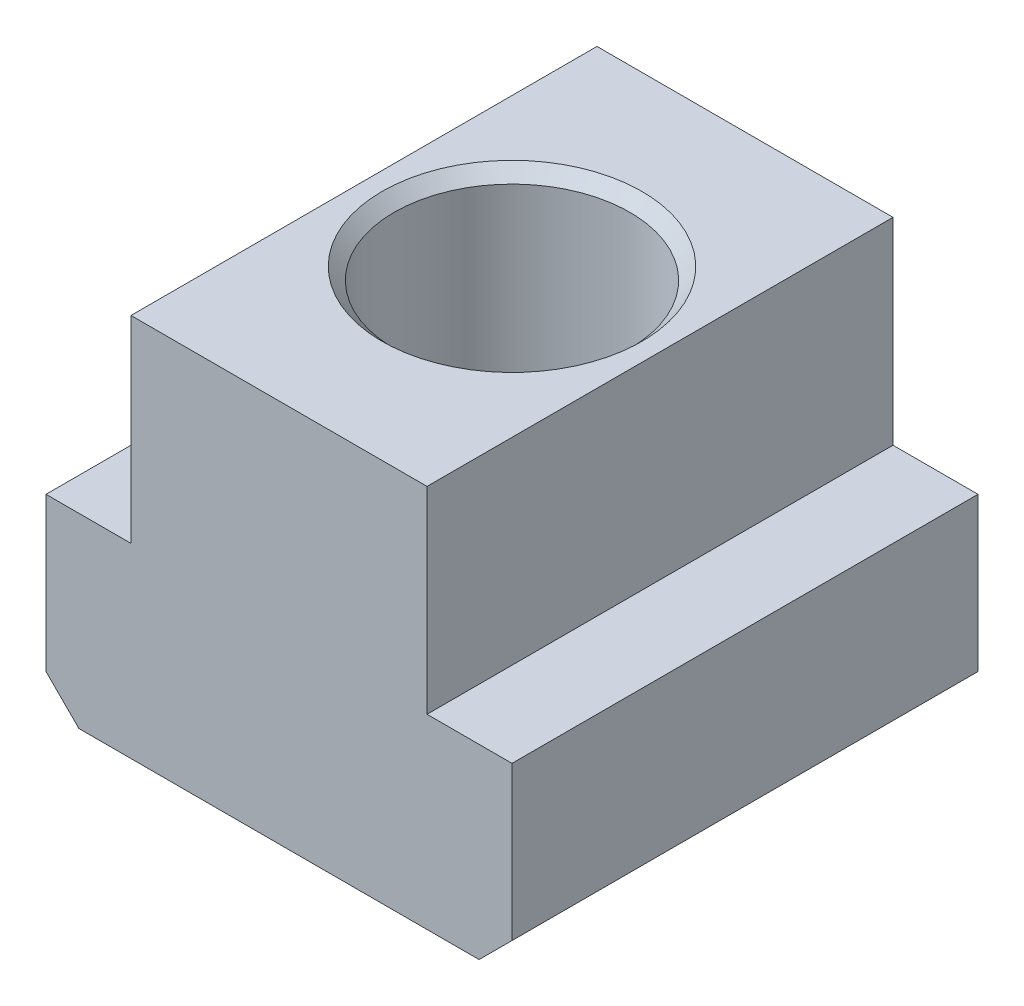
ISO-10303-21;
HEADER;
FILE_DESCRIPTION(('STEP AP214'),'2;1');
FILE_NAME('part.step','',(''),(''),'','','');
FILE_SCHEMA(('AUTOMOTIVE_DESIGN { 1 0 10303 214 1 1 1 1 }'));
ENDSEC;
DATA;
#1=APPLICATION_CONTEXT('core data for automotive mechanical design processes');
#2=APPLICATION_PROTOCOL_DEFINITION('international standard','automotive_design',2000,#1);
#3=PRODUCT_CONTEXT('',#1,'mechanical');
#4=PRODUCT('Part','Part','',(#3));
#5=PRODUCT_RELATED_PRODUCT_CATEGORY('part','',(#4));
#6=PRODUCT_DEFINITION_FORMATION('','',#4);
#7=PRODUCT_DEFINITION_CONTEXT('part definition',#1,'design');
#8=PRODUCT_DEFINITION('design','',#6,#7);
#9=PRODUCT_DEFINITION_SHAPE('','',#8);
#10=(LENGTH_UNIT() NAMED_UNIT(*) SI_UNIT(.MILLI.,.METRE.));
#11=(NAMED_UNIT(*) PLANE_ANGLE_UNIT() SI_UNIT($,.RADIAN.));
#12=(NAMED_UNIT(*) SI_UNIT($,.STERADIAN.) SOLID_ANGLE_UNIT());
#13=UNCERTAINTY_MEASURE_WITH_UNIT(LENGTH_MEASURE(1.E-05),#10,'distance_accuracy_value','');
#14=(GEOMETRIC_REPRESENTATION_CONTEXT(3) GLOBAL_UNCERTAINTY_ASSIGNED_CONTEXT((#13)) GLOBAL_UNIT_ASSIGNED_CONTEXT((#10,
#11,#12)) REPRESENTATION_CONTEXT('',''));
#15=CARTESIAN_POINT('',(0.,0.,0.));
#16=DIRECTION('',(0.,0.,1.));
#17=DIRECTION('',(1.,0.,0.));
#18=AXIS2_PLACEMENT_3D('',#15,#16,#17);
#19=CARTESIAN_POINT('',(-42.5,0.,-85.));
#20=DIRECTION('',(-1.,0.,0.));
#21=DIRECTION('',(0.,0.,1.));
#22=AXIS2_PLACEMENT_3D('',#19,#20,#21);
#23=PLANE('',#22);
#24=DIRECTION('',(0.,-1.,0.));
#25=VECTOR('',#24,1.);
#26=CARTESIAN_POINT('',(-42.5,0.,-85.));
#27=LINE('',#26,#25);
#28=CARTESIAN_POINT('',(-42.5,34.,-85.));
#29=VERTEX_POINT('',#28);
#30=CARTESIAN_POINT('',(-42.5,6.0000000000001,-85.));
#31=VERTEX_POINT('',#30);
#32=EDGE_CURVE('E166',#29,#31,#27,.T.);
#33=ORIENTED_EDGE('',*,*,#32,.T.);
#34=DIRECTION('',(0.,0.,1.));
#35=VECTOR('',#34,1.);
#36=CARTESIAN_POINT('',(-42.5,6.0000000000001,-85.));
#37=LINE('',#36,#35);
#38=CARTESIAN_POINT('',(-42.5,6.0000000000001,0.));
#39=VERTEX_POINT('',#38);
#40=EDGE_CURVE('E189',#31,#39,#37,.T.);
#41=ORIENTED_EDGE('',*,*,#40,.T.);
#42=DIRECTION('',(0.,-1.,0.));
#43=VECTOR('',#42,1.);
#44=CARTESIAN_POINT('',(-42.5,0.,0.));
#45=LINE('',#44,#43);
#46=CARTESIAN_POINT('',(-42.5,34.,0.));
#47=VERTEX_POINT('',#46);
#48=EDGE_CURVE('E145',#47,#39,#45,.T.);
#49=ORIENTED_EDGE('',*,*,#48,.F.);
#50=DIRECTION('',(0.,0.,1.));
#51=VECTOR('',#50,1.);
#52=CARTESIAN_POINT('',(-42.5,34.,-85.));
#53=LINE('',#52,#51);
#54=EDGE_CURVE('E167',#29,#47,#53,.T.);
#55=ORIENTED_EDGE('',*,*,#54,.F.);
#56=EDGE_LOOP('',(#33,#41,#49,#55));
#57=FACE_BOUND('',#56,.T.);
#58=ADVANCED_FACE('F32',(#57),#23,.T.);
#59=CARTESIAN_POINT('',(-42.5,34.,-85.));
#60=DIRECTION('',(0.,1.,0.));
#61=DIRECTION('',(0.,0.,1.));
#62=AXIS2_PLACEMENT_3D('',#59,#60,#61);
#63=PLANE('',#62);
#64=DIRECTION('',(-1.,0.,0.));
#65=VECTOR('',#64,1.);
#66=CARTESIAN_POINT('',(-42.5,34.,0.));
#67=LINE('',#66,#65);
#68=CARTESIAN_POINT('',(-27.,34.,0.));
#69=VERTEX_POINT('',#68);
#70=EDGE_CURVE('E163',#69,#47,#67,.T.);
#71=ORIENTED_EDGE('',*,*,#70,.F.);
#72=DIRECTION('',(0.,0.,1.));
#73=VECTOR('',#72,1.);
#74=CARTESIAN_POINT('',(-27.,34.,-85.));
#75=LINE('',#74,#73);
#76=CARTESIAN_POINT('',(-27.,34.,-85.));
#77=VERTEX_POINT('',#76);
#78=EDGE_CURVE('E170',#77,#69,#75,.T.);
#79=ORIENTED_EDGE('',*,*,#78,.F.);
#80=DIRECTION('',(-1.,0.,0.));
#81=VECTOR('',#80,1.);
#82=CARTESIAN_POINT('',(-42.5,34.,-85.));
#83=LINE('',#82,#81);
#84=EDGE_CURVE('E126',#77,#29,#83,.T.);
#85=ORIENTED_EDGE('',*,*,#84,.T.);
#86=ORIENTED_EDGE('',*,*,#54,.T.);
#87=EDGE_LOOP('',(#71,#79,#85,#86));
#88=FACE_BOUND('',#87,.T.);
#89=ADVANCED_FACE('F238',(#88),#63,.T.);
#90=CARTESIAN_POINT('',(-27.,34.,-85.));
#91=DIRECTION('',(-1.,0.,0.));
#92=DIRECTION('',(0.,0.,1.));
#93=AXIS2_PLACEMENT_3D('',#90,#91,#92);
#94=PLANE('',#93);
#95=DIRECTION('',(0.,-1.,0.));
#96=VECTOR('',#95,1.);
#97=CARTESIAN_POINT('',(-27.,34.,0.));
#98=LINE('',#97,#96);
#99=CARTESIAN_POINT('',(-27.,70.,0.));
#100=VERTEX_POINT('',#99);
#101=EDGE_CURVE('E160',#100,#69,#98,.T.);
#102=ORIENTED_EDGE('',*,*,#101,.F.);
#103=DIRECTION('',(0.,0.,1.));
#104=VECTOR('',#103,1.);
#105=CARTESIAN_POINT('',(-27.,70.,-85.));
#106=LINE('',#105,#104);
#107=CARTESIAN_POINT('',(-27.,70.,-85.));
#108=VERTEX_POINT('',#107);
#109=EDGE_CURVE('E172',#108,#100,#106,.T.);
#110=ORIENTED_EDGE('',*,*,#109,.F.);
#111=DIRECTION('',(0.,-1.,0.));
#112=VECTOR('',#111,1.);
#113=CARTESIAN_POINT('',(-27.,34.,-85.));
#114=LINE('',#113,#112);
#115=EDGE_CURVE('E140',#108,#77,#114,.T.);
#116=ORIENTED_EDGE('',*,*,#115,.T.);
#117=ORIENTED_EDGE('',*,*,#78,.T.);
#118=EDGE_LOOP('',(#102,#110,#116,#117));
#119=FACE_BOUND('',#118,.T.);
#120=ADVANCED_FACE('F254',(#119),#94,.T.);
#121=CARTESIAN_POINT('',(-27.,70.,-85.));
#122=DIRECTION('',(0.,1.,0.));
#123=DIRECTION('',(0.,0.,1.));
#124=AXIS2_PLACEMENT_3D('',#121,#122,#123);
#125=PLANE('',#124);
#126=CARTESIAN_POINT('',(0.,70.,-42.5));
#127=DIRECTION('',(0.,1.,0.));
#128=DIRECTION('',(0.,0.,1.));
#129=AXIS2_PLACEMENT_3D('',#126,#127,#128);
#130=CIRCLE('',#129,23.7);
#131=CARTESIAN_POINT('',(-23.7,70.,-42.5));
#132=VERTEX_POINT('',#131);
#133=EDGE_CURVE('E40',#132,#132,#130,.F.);
#134=ORIENTED_EDGE('',*,*,#133,.T.);
#135=EDGE_LOOP('',(#134));
#136=FACE_BOUND('',#135,.T.);
#137=DIRECTION('',(-1.,0.,0.));
#138=VECTOR('',#137,1.);
#139=CARTESIAN_POINT('',(-27.,70.,0.));
#140=LINE('',#139,#138);
#141=CARTESIAN_POINT('',(27.,70.,0.));
#142=VERTEX_POINT('',#141);
#143=EDGE_CURVE('E157',#142,#100,#140,.T.);
#144=ORIENTED_EDGE('',*,*,#143,.F.);
#145=DIRECTION('',(0.,0.,1.));
#146=VECTOR('',#145,1.);
#147=CARTESIAN_POINT('',(27.,70.,-85.));
#148=LINE('',#147,#146);
#149=CARTESIAN_POINT('',(27.,70.,-85.));
#150=VERTEX_POINT('',#149);
#151=EDGE_CURVE('E174',#150,#142,#148,.T.);
#152=ORIENTED_EDGE('',*,*,#151,.F.);
#153=DIRECTION('',(-1.,0.,0.));
#154=VECTOR('',#153,1.);
#155=CARTESIAN_POINT('',(-27.,70.,-85.));
#156=LINE('',#155,#154);
#157=EDGE_CURVE('E134',#150,#108,#156,.T.);
#158=ORIENTED_EDGE('',*,*,#157,.T.);
#159=ORIENTED_EDGE('',*,*,#109,.T.);
#160=EDGE_LOOP('',(#144,#152,#158,#159));
#161=FACE_BOUND('',#160,.T.);
#162=ADVANCED_FACE('F200',(#136,#161),#125,.T.);
#163=CARTESIAN_POINT('',(27.,34.,-85.));
#164=DIRECTION('',(1.,0.,0.));
#165=DIRECTION('',(0.,1.,0.));
#166=AXIS2_PLACEMENT_3D('',#163,#164,#165);
#167=PLANE('',#166);
#168=DIRECTION('',(0.,1.,0.));
#169=VECTOR('',#168,1.);
#170=CARTESIAN_POINT('',(27.,34.,0.));
#171=LINE('',#170,#169);
#172=CARTESIAN_POINT('',(27.,34.,0.));
#173=VERTEX_POINT('',#172);
#174=EDGE_CURVE('E154',#173,#142,#171,.T.);
#175=ORIENTED_EDGE('',*,*,#174,.F.);
#176=DIRECTION('',(0.,0.,1.));
#177=VECTOR('',#176,1.);
#178=CARTESIAN_POINT('',(27.,34.,-85.));
#179=LINE('',#178,#177);
#180=CARTESIAN_POINT('',(27.,34.,-85.));
#181=VERTEX_POINT('',#180);
#182=EDGE_CURVE('E125',#181,#173,#179,.T.);
#183=ORIENTED_EDGE('',*,*,#182,.F.);
#184=DIRECTION('',(0.,1.,0.));
#185=VECTOR('',#184,1.);
#186=CARTESIAN_POINT('',(27.,34.,-85.));
#187=LINE('',#186,#185);
#188=EDGE_CURVE('E132',#181,#150,#187,.T.);
#189=ORIENTED_EDGE('',*,*,#188,.T.);
#190=ORIENTED_EDGE('',*,*,#151,.T.);
#191=EDGE_LOOP('',(#175,#183,#189,#190));
#192=FACE_BOUND('',#191,.T.);
#193=ADVANCED_FACE('F246',(#192),#167,.T.);
#194=CARTESIAN_POINT('',(27.,34.,-85.));
#195=DIRECTION('',(0.,1.,0.));
#196=DIRECTION('',(0.,0.,1.));
#197=AXIS2_PLACEMENT_3D('',#194,#195,#196);
#198=PLANE('',#197);
#199=DIRECTION('',(-1.,0.,0.));
#200=VECTOR('',#199,1.);
#201=CARTESIAN_POINT('',(27.,34.,0.));
#202=LINE('',#201,#200);
#203=CARTESIAN_POINT('',(42.5,34.,0.));
#204=VERTEX_POINT('',#203);
#205=EDGE_CURVE('E124',#204,#173,#202,.T.);
#206=ORIENTED_EDGE('',*,*,#205,.F.);
#207=DIRECTION('',(0.,0.,1.));
#208=VECTOR('',#207,1.);
#209=CARTESIAN_POINT('',(42.5,34.,-85.));
#210=LINE('',#209,#208);
#211=CARTESIAN_POINT('',(42.5,34.,-85.));
#212=VERTEX_POINT('',#211);
#213=EDGE_CURVE('E113',#212,#204,#210,.T.);
#214=ORIENTED_EDGE('',*,*,#213,.F.);
#215=DIRECTION('',(-1.,0.,0.));
#216=VECTOR('',#215,1.);
#217=CARTESIAN_POINT('',(27.,34.,-85.));
#218=LINE('',#217,#216);
#219=EDGE_CURVE('E117',#212,#181,#218,.T.);
#220=ORIENTED_EDGE('',*,*,#219,.T.);
#221=ORIENTED_EDGE('',*,*,#182,.T.);
#222=EDGE_LOOP('',(#206,#214,#220,#221));
#223=FACE_BOUND('',#222,.T.);
#224=ADVANCED_FACE('F122',(#223),#198,.T.);
#225=CARTESIAN_POINT('',(42.5,0.,-85.));
#226=DIRECTION('',(1.,0.,0.));
#227=DIRECTION('',(0.,1.,0.));
#228=AXIS2_PLACEMENT_3D('',#225,#226,#227);
#229=PLANE('',#228);
#230=DIRECTION('',(0.,1.,0.));
#231=VECTOR('',#230,1.);
#232=CARTESIAN_POINT('',(42.5,0.,0.));
#233=LINE('',#232,#231);
#234=CARTESIAN_POINT('',(42.5,6.00000000000011,0.));
#235=VERTEX_POINT('',#234);
#236=EDGE_CURVE('E151',#235,#204,#233,.T.);
#237=ORIENTED_EDGE('',*,*,#236,.F.);
#238=DIRECTION('',(0.,0.,-1.));
#239=VECTOR('',#238,1.);
#240=CARTESIAN_POINT('',(42.5,6.00000000000011,-85.));
#241=LINE('',#240,#239);
#242=CARTESIAN_POINT('',(42.5,6.00000000000011,-85.));
#243=VERTEX_POINT('',#242);
#244=EDGE_CURVE('E55',#235,#243,#241,.T.);
#245=ORIENTED_EDGE('',*,*,#244,.T.);
#246=DIRECTION('',(0.,1.,0.));
#247=VECTOR('',#246,1.);
#248=CARTESIAN_POINT('',(42.5,0.,-85.));
#249=LINE('',#248,#247);
#250=EDGE_CURVE('E110',#243,#212,#249,.T.);
#251=ORIENTED_EDGE('',*,*,#250,.T.);
#252=ORIENTED_EDGE('',*,*,#213,.T.);
#253=EDGE_LOOP('',(#237,#245,#251,#252));
#254=FACE_BOUND('',#253,.T.);
#255=ADVANCED_FACE('F112',(#254),#229,.T.);
#256=CARTESIAN_POINT('',(-42.5,0.,-85.));
#257=DIRECTION('',(0.,-1.,0.));
#258=DIRECTION('',(1.,0.,0.));
#259=AXIS2_PLACEMENT_3D('',#256,#257,#258);
#260=PLANE('',#259);
#261=CARTESIAN_POINT('',(0.,0.,-42.5));
#262=DIRECTION('',(0.,-1.,0.));
#263=DIRECTION('',(1.,0.,0.));
#264=AXIS2_PLACEMENT_3D('',#261,#262,#263);
#265=CIRCLE('',#264,23.7);
#266=CARTESIAN_POINT('',(23.7,0.,-42.5));
#267=VERTEX_POINT('',#266);
#268=EDGE_CURVE('E11',#267,#267,#265,.F.);
#269=ORIENTED_EDGE('',*,*,#268,.T.);
#270=EDGE_LOOP('',(#269));
#271=FACE_BOUND('',#270,.T.);
#272=DIRECTION('',(1.,0.,0.));
#273=VECTOR('',#272,1.);
#274=CARTESIAN_POINT('',(-42.5,0.,-85.));
#275=LINE('',#274,#273);
#276=CARTESIAN_POINT('',(-36.5,0.,-85.));
#277=VERTEX_POINT('',#276);
#278=CARTESIAN_POINT('',(36.5,0.,-85.));
#279=VERTEX_POINT('',#278);
#280=EDGE_CURVE('E118',#277,#279,#275,.T.);
#281=ORIENTED_EDGE('',*,*,#280,.T.);
#282=DIRECTION('',(0.,0.,1.));
#283=VECTOR('',#282,1.);
#284=CARTESIAN_POINT('',(36.5,0.,-85.));
#285=LINE('',#284,#283);
#286=CARTESIAN_POINT('',(36.5,0.,0.));
#287=VERTEX_POINT('',#286);
#288=EDGE_CURVE('E178',#279,#287,#285,.T.);
#289=ORIENTED_EDGE('',*,*,#288,.T.);
#290=DIRECTION('',(1.,0.,0.));
#291=VECTOR('',#290,1.);
#292=CARTESIAN_POINT('',(-42.5,0.,0.));
#293=LINE('',#292,#291);
#294=CARTESIAN_POINT('',(-36.5,0.,0.));
#295=VERTEX_POINT('',#294);
#296=EDGE_CURVE('E148',#295,#287,#293,.T.);
#297=ORIENTED_EDGE('',*,*,#296,.F.);
#298=DIRECTION('',(0.,0.,-1.));
#299=VECTOR('',#298,1.);
#300=CARTESIAN_POINT('',(-36.5,0.,-85.));
#301=LINE('',#300,#299);
#302=EDGE_CURVE('E169',#295,#277,#301,.T.);
#303=ORIENTED_EDGE('',*,*,#302,.T.);
#304=EDGE_LOOP('',(#281,#289,#297,#303));
#305=FACE_BOUND('',#304,.T.);
#306=ADVANCED_FACE('F219',(#271,#305),#260,.T.);
#307=CARTESIAN_POINT('',(-42.5,34.,-85.));
#308=DIRECTION('',(0.,0.,-1.));
#309=DIRECTION('',(-1.,0.,0.));
#310=AXIS2_PLACEMENT_3D('',#307,#308,#309);
#311=PLANE('',#310);
#312=ORIENTED_EDGE('',*,*,#250,.F.);
#313=DIRECTION('',(0.707106781186544,0.707106781186551,0.));
#314=VECTOR('',#313,1.);
#315=CARTESIAN_POINT('',(14.0000000000004,-22.4999999999998,-85.));
#316=LINE('',#315,#314);
#317=EDGE_CURVE('E187',#243,#279,#316,.F.);
#318=ORIENTED_EDGE('',*,*,#317,.T.);
#319=ORIENTED_EDGE('',*,*,#280,.F.);
#320=DIRECTION('',(0.707106781186544,-0.707106781186551,0.));
#321=VECTOR('',#320,1.);
#322=CARTESIAN_POINT('',(-56.5,20.0000000000002,-85.));
#323=LINE('',#322,#321);
#324=EDGE_CURVE('E47',#277,#31,#323,.F.);
#325=ORIENTED_EDGE('',*,*,#324,.T.);
#326=ORIENTED_EDGE('',*,*,#32,.F.);
#327=ORIENTED_EDGE('',*,*,#84,.F.);
#328=ORIENTED_EDGE('',*,*,#115,.F.);
#329=ORIENTED_EDGE('',*,*,#157,.F.);
#330=ORIENTED_EDGE('',*,*,#188,.F.);
#331=ORIENTED_EDGE('',*,*,#219,.F.);
#332=EDGE_LOOP('',(#312,#318,#319,#325,#326,#327,#328,#329,#330,#331));
#333=FACE_BOUND('',#332,.T.);
#334=ADVANCED_FACE('F129',(#333),#311,.T.);
#335=CARTESIAN_POINT('',(-42.5,34.,0.));
#336=DIRECTION('',(0.,0.,-1.));
#337=DIRECTION('',(-1.,0.,0.));
#338=AXIS2_PLACEMENT_3D('',#335,#336,#337);
#339=PLANE('',#338);
#340=ORIENTED_EDGE('',*,*,#296,.T.);
#341=DIRECTION('',(-0.707106781186544,-0.707106781186551,0.));
#342=VECTOR('',#341,1.);
#343=CARTESIAN_POINT('',(36.5,0.,0.));
#344=LINE('',#343,#342);
#345=EDGE_CURVE('E183',#287,#235,#344,.F.);
#346=ORIENTED_EDGE('',*,*,#345,.T.);
#347=ORIENTED_EDGE('',*,*,#236,.T.);
#348=ORIENTED_EDGE('',*,*,#205,.T.);
#349=ORIENTED_EDGE('',*,*,#174,.T.);
#350=ORIENTED_EDGE('',*,*,#143,.T.);
#351=ORIENTED_EDGE('',*,*,#101,.T.);
#352=ORIENTED_EDGE('',*,*,#70,.T.);
#353=ORIENTED_EDGE('',*,*,#48,.T.);
#354=DIRECTION('',(-0.707106781186544,0.707106781186551,0.));
#355=VECTOR('',#354,1.);
#356=CARTESIAN_POINT('',(-42.5,6.0000000000001,0.));
#357=LINE('',#356,#355);
#358=EDGE_CURVE('E181',#39,#295,#357,.F.);
#359=ORIENTED_EDGE('',*,*,#358,.T.);
#360=EDGE_LOOP('',(#340,#346,#347,#348,#349,#350,#351,#352,#353,#359));
#361=FACE_BOUND('',#360,.T.);
#362=ADVANCED_FACE('F230',(#361),#339,.F.);
#363=CARTESIAN_POINT('',(36.5,0.,-85.));
#364=DIRECTION('',(-0.707106781186551,0.707106781186544,0.));
#365=DIRECTION('',(-0.707106781186544,-0.707106781186551,0.));
#366=AXIS2_PLACEMENT_3D('',#363,#364,#365);
#367=PLANE('',#366);
#368=ORIENTED_EDGE('',*,*,#317,.F.);
#369=ORIENTED_EDGE('',*,*,#244,.F.);
#370=ORIENTED_EDGE('',*,*,#345,.F.);
#371=ORIENTED_EDGE('',*,*,#288,.F.);
#372=EDGE_LOOP('',(#368,#369,#370,#371));
#373=FACE_BOUND('',#372,.T.);
#374=ADVANCED_FACE('F228',(#373),#367,.F.);
#375=CARTESIAN_POINT('',(-42.5,6.0000000000001,-85.));
#376=DIRECTION('',(0.707106781186551,0.707106781186544,0.));
#377=DIRECTION('',(-0.707106781186544,0.707106781186551,0.));
#378=AXIS2_PLACEMENT_3D('',#375,#376,#377);
#379=PLANE('',#378);
#380=ORIENTED_EDGE('',*,*,#324,.F.);
#381=ORIENTED_EDGE('',*,*,#302,.F.);
#382=ORIENTED_EDGE('',*,*,#358,.F.);
#383=ORIENTED_EDGE('',*,*,#40,.F.);
#384=EDGE_LOOP('',(#380,#381,#382,#383));
#385=FACE_BOUND('',#384,.T.);
#386=ADVANCED_FACE('F211',(#385),#379,.F.);
#387=CARTESIAN_POINT('',(0.,0.,-42.5));
#388=DIRECTION('',(0.,1.,0.));
#389=DIRECTION('',(-1.,0.,0.));
#390=AXIS2_PLACEMENT_3D('',#387,#388,#389);
#391=CYLINDRICAL_SURFACE('',#390,21.5);
#392=CARTESIAN_POINT('',(0.,67.8,-42.5));
#393=DIRECTION('',(0.,1.,0.));
#394=DIRECTION('',(-1.,0.,0.));
#395=AXIS2_PLACEMENT_3D('',#392,#393,#394);
#396=CIRCLE('',#395,21.5);
#397=CARTESIAN_POINT('',(-21.5,67.8,-42.5));
#398=VERTEX_POINT('',#397);
#399=EDGE_CURVE('E195',#398,#398,#396,.T.);
#400=ORIENTED_EDGE('',*,*,#399,.T.);
#401=EDGE_LOOP('',(#400));
#402=FACE_BOUND('',#401,.T.);
#403=CARTESIAN_POINT('',(0.,2.2,-42.5));
#404=DIRECTION('',(0.,-1.,0.));
#405=DIRECTION('',(1.,0.,0.));
#406=AXIS2_PLACEMENT_3D('',#403,#404,#405);
#407=CIRCLE('',#406,21.5);
#408=CARTESIAN_POINT('',(21.5,2.19999999999999,-42.5));
#409=VERTEX_POINT('',#408);
#410=EDGE_CURVE('E192',#409,#409,#407,.T.);
#411=ORIENTED_EDGE('',*,*,#410,.T.);
#412=EDGE_LOOP('',(#411));
#413=FACE_BOUND('',#412,.T.);
#414=ADVANCED_FACE('F206',(#402,#413),#391,.F.);
#415=CARTESIAN_POINT('',(0.,67.8,-42.5));
#416=DIRECTION('',(0.,1.,0.));
#417=DIRECTION('',(-1.,0.,0.));
#418=AXIS2_PLACEMENT_3D('',#415,#416,#417);
#419=CONICAL_SURFACE('',#418,21.5,0.785398163397443);
#420=CARTESIAN_POINT('',(-23.7,70.,-42.5));
#421=CARTESIAN_POINT('',(-23.6770833333333,69.9770833333333,-42.5));
#422=CARTESIAN_POINT('',(-23.6541666666666,69.9541666666667,-42.5));
#423=CARTESIAN_POINT('',(-23.6083333333333,69.9083333333333,-42.5));
#424=CARTESIAN_POINT('',(-23.5854166666666,69.8854166666667,-42.5));
#425=CARTESIAN_POINT('',(-23.5395833333333,69.8395833333333,-42.5));
#426=CARTESIAN_POINT('',(-23.5166666666666,69.8166666666667,-42.5));
#427=CARTESIAN_POINT('',(-23.4708333333333,69.7708333333333,-42.5));
#428=CARTESIAN_POINT('',(-23.4479166666666,69.7479166666667,-42.5));
#429=CARTESIAN_POINT('',(-23.4020833333333,69.7020833333333,-42.5));
#430=CARTESIAN_POINT('',(-23.3791666666666,69.6791666666667,-42.5));
#431=CARTESIAN_POINT('',(-23.3333333333333,69.6333333333333,-42.5));
#432=CARTESIAN_POINT('',(-23.3104166666667,69.6104166666667,-42.5));
#433=CARTESIAN_POINT('',(-23.2645833333333,69.5645833333333,-42.5));
#434=CARTESIAN_POINT('',(-23.2416666666666,69.5416666666667,-42.5));
#435=CARTESIAN_POINT('',(-23.1958333333333,69.4958333333333,-42.5));
#436=CARTESIAN_POINT('',(-23.1729166666667,69.4729166666667,-42.5));
#437=CARTESIAN_POINT('',(-23.1270833333333,69.4270833333333,-42.5));
#438=CARTESIAN_POINT('',(-23.1041666666666,69.4041666666667,-42.5));
#439=CARTESIAN_POINT('',(-23.0583333333333,69.3583333333333,-42.5));
#440=CARTESIAN_POINT('',(-23.0354166666667,69.3354166666667,-42.5));
#441=CARTESIAN_POINT('',(-22.9895833333333,69.2895833333333,-42.5));
#442=CARTESIAN_POINT('',(-22.9666666666667,69.2666666666667,-42.5));
#443=CARTESIAN_POINT('',(-22.9208333333333,69.2208333333333,-42.5));
#444=CARTESIAN_POINT('',(-22.8979166666667,69.1979166666667,-42.5));
#445=CARTESIAN_POINT('',(-22.8520833333333,69.1520833333333,-42.5));
#446=CARTESIAN_POINT('',(-22.8291666666667,69.1291666666667,-42.5));
#447=CARTESIAN_POINT('',(-22.7833333333333,69.0833333333333,-42.5));
#448=CARTESIAN_POINT('',(-22.7604166666667,69.0604166666667,-42.5));
#449=CARTESIAN_POINT('',(-22.7145833333333,69.0145833333333,-42.5));
#450=CARTESIAN_POINT('',(-22.6916666666667,68.9916666666667,-42.5));
#451=CARTESIAN_POINT('',(-22.6458333333333,68.9458333333333,-42.5));
#452=CARTESIAN_POINT('',(-22.6229166666667,68.9229166666667,-42.5));
#453=CARTESIAN_POINT('',(-22.5770833333333,68.8770833333333,-42.5));
#454=CARTESIAN_POINT('',(-22.5541666666667,68.8541666666667,-42.5));
#455=CARTESIAN_POINT('',(-22.5083333333333,68.8083333333333,-42.5));
#456=CARTESIAN_POINT('',(-22.4854166666667,68.7854166666667,-42.5));
#457=CARTESIAN_POINT('',(-22.4395833333333,68.7395833333333,-42.5));
#458=CARTESIAN_POINT('',(-22.4166666666667,68.7166666666667,-42.5));
#459=CARTESIAN_POINT('',(-22.3708333333333,68.6708333333333,-42.5));
#460=CARTESIAN_POINT('',(-22.3479166666667,68.6479166666667,-42.5));
#461=CARTESIAN_POINT('',(-22.3020833333333,68.6020833333333,-42.5));
#462=CARTESIAN_POINT('',(-22.2791666666667,68.5791666666667,-42.5));
#463=CARTESIAN_POINT('',(-22.2333333333333,68.5333333333333,-42.5));
#464=CARTESIAN_POINT('',(-22.2104166666667,68.5104166666667,-42.5));
#465=CARTESIAN_POINT('',(-22.1645833333333,68.4645833333333,-42.5));
#466=CARTESIAN_POINT('',(-22.1416666666667,68.4416666666667,-42.5));
#467=CARTESIAN_POINT('',(-22.0958333333333,68.3958333333333,-42.5));
#468=CARTESIAN_POINT('',(-22.0729166666667,68.3729166666667,-42.5));
#469=CARTESIAN_POINT('',(-22.0270833333333,68.3270833333333,-42.5));
#470=CARTESIAN_POINT('',(-22.0041666666667,68.3041666666667,-42.5));
#471=CARTESIAN_POINT('',(-21.9583333333333,68.2583333333333,-42.5));
#472=CARTESIAN_POINT('',(-21.9354166666667,68.2354166666667,-42.5));
#473=CARTESIAN_POINT('',(-21.8895833333333,68.1895833333333,-42.5));
#474=CARTESIAN_POINT('',(-21.8666666666667,68.1666666666667,-42.5));
#475=CARTESIAN_POINT('',(-21.8208333333333,68.1208333333333,-42.5));
#476=CARTESIAN_POINT('',(-21.7979166666667,68.0979166666667,-42.5));
#477=CARTESIAN_POINT('',(-21.7520833333333,68.0520833333333,-42.5));
#478=CARTESIAN_POINT('',(-21.7291666666667,68.0291666666667,-42.5));
#479=CARTESIAN_POINT('',(-21.6833333333333,67.9833333333333,-42.5));
#480=CARTESIAN_POINT('',(-21.6604166666667,67.9604166666667,-42.5));
#481=CARTESIAN_POINT('',(-21.6145833333333,67.9145833333334,-42.5));
#482=CARTESIAN_POINT('',(-21.5916666666667,67.8916666666667,-42.5));
#483=CARTESIAN_POINT('',(-21.5458333333333,67.8458333333333,-42.5));
#484=CARTESIAN_POINT('',(-21.5229166666667,67.8229166666667,-42.5));
#485=CARTESIAN_POINT('',(-21.5,67.8,-42.5));
#486=B_SPLINE_CURVE_WITH_KNOTS('',3,(#420,#421,#422,#423,#424,#425,#426,#427,#428,#429,#430,
#431,#432,#433,#434,#435,#436,#437,#438,#439,#440,#441,#442,#443,#444,#445,#446,#447,#448,#449,
#450,#451,#452,#453,#454,#455,#456,#457,#458,#459,#460,#461,#462,#463,#464,#465,#466,#467,#468,
#469,#470,#471,#472,#473,#474,#475,#476,#477,#478,#479,#480,#481,#482,#483,#484,#485),
.UNSPECIFIED.,.F.,.F.,(4,2,2,2,2,2,2,2,2,2,2,2,2,2,2,2,2,2,2,2,2,2,2,2,2,2,2,2,2,2,2,2,4),(0.,
0.0972271824131445,0.194454364826299,0.291681547239443,0.388908729652598,0.486135912065742,
0.583363094478894,0.680590276892038,0.777817459305193,0.875044641718337,0.972271824131491,
1.06949900654464,1.16672618895779,1.26395337137093,1.36118055378409,1.45840773619723,
1.55563491861039,1.65286210102354,1.75008928343668,1.84731646584984,1.94454364826298,
2.04177083067614,2.13899801308928,2.23622519550244,2.33345237791558,2.43067956032874,
2.52790674274188,2.62513392515503,2.72236110756818,2.81958828998133,2.91681547239447,
3.01404265480763,3.11126983722078),.UNSPECIFIED.);
#487=EDGE_CURVE('BSEAM203',#132,#398,#486,.T.);
#488=ORIENTED_EDGE('',*,*,#133,.F.);
#489=ORIENTED_EDGE('',*,*,#399,.F.);
#490=ORIENTED_EDGE('',*,*,#487,.T.);
#491=ORIENTED_EDGE('',*,*,#487,.F.);
#492=EDGE_LOOP('',(#488,#490,#489,#491));
#493=FACE_BOUND('',#492,.T.);
#494=ADVANCED_FACE('F203',(#493),#419,.F.);
#495=CARTESIAN_POINT('',(0.,0.,-42.5));
#496=DIRECTION('',(0.,-1.,0.));
#497=DIRECTION('',(1.,0.,0.));
#498=AXIS2_PLACEMENT_3D('',#495,#496,#497);
#499=CONICAL_SURFACE('',#498,23.7,0.785398163397444);
#500=ORIENTED_EDGE('',*,*,#410,.F.);
#501=EDGE_LOOP('',(#500));
#502=FACE_BOUND('',#501,.T.);
#503=ORIENTED_EDGE('',*,*,#268,.F.);
#504=EDGE_LOOP('',(#503));
#505=FACE_BOUND('',#504,.T.);
#506=ADVANCED_FACE('F34',(#502,#505),#499,.F.);
#507=CLOSED_SHELL('',(#58,#89,#120,#162,#193,#224,#255,#306,#334,#362,#374,#386,#414,#494,#506));
#508=MANIFOLD_SOLID_BREP('B2',#507);
#509=ADVANCED_BREP_SHAPE_REPRESENTATION('',(#18,#508),#14);
#510=SHAPE_DEFINITION_REPRESENTATION(#9,#509);
ENDSEC;
END-ISO-10303-21;
